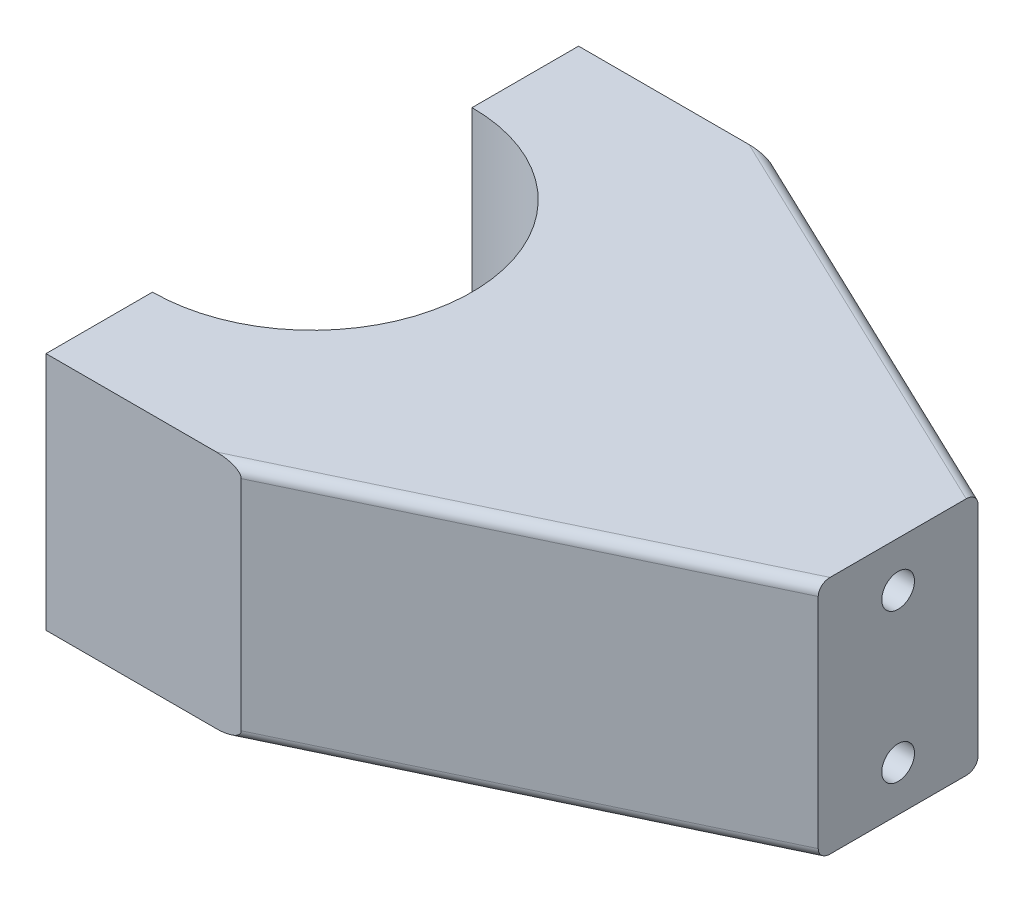
ISO-10303-21;
HEADER;
FILE_DESCRIPTION(('STEP AP214'),'2;1');
FILE_NAME('part.step','',(''),(''),'','','');
FILE_SCHEMA(('AUTOMOTIVE_DESIGN { 1 0 10303 214 1 1 1 1 }'));
ENDSEC;
DATA;
#1=APPLICATION_CONTEXT('core data for automotive mechanical design processes');
#2=APPLICATION_PROTOCOL_DEFINITION('international standard','automotive_design',2000,#1);
#3=PRODUCT_CONTEXT('',#1,'mechanical');
#4=PRODUCT('Part','Part','',(#3));
#5=PRODUCT_RELATED_PRODUCT_CATEGORY('part','',(#4));
#6=PRODUCT_DEFINITION_FORMATION('','',#4);
#7=PRODUCT_DEFINITION_CONTEXT('part definition',#1,'design');
#8=PRODUCT_DEFINITION('design','',#6,#7);
#9=PRODUCT_DEFINITION_SHAPE('','',#8);
#10=(LENGTH_UNIT() NAMED_UNIT(*) SI_UNIT(.MILLI.,.METRE.));
#11=(NAMED_UNIT(*) PLANE_ANGLE_UNIT() SI_UNIT($,.RADIAN.));
#12=(NAMED_UNIT(*) SI_UNIT($,.STERADIAN.) SOLID_ANGLE_UNIT());
#13=UNCERTAINTY_MEASURE_WITH_UNIT(LENGTH_MEASURE(1.E-05),#10,'distance_accuracy_value','');
#14=(GEOMETRIC_REPRESENTATION_CONTEXT(3) GLOBAL_UNCERTAINTY_ASSIGNED_CONTEXT((#13)) GLOBAL_UNIT_ASSIGNED_CONTEXT((#10,
#11,#12)) REPRESENTATION_CONTEXT('',''));
#15=CARTESIAN_POINT('',(0.,0.,0.));
#16=DIRECTION('',(0.,0.,1.));
#17=DIRECTION('',(1.,0.,0.));
#18=AXIS2_PLACEMENT_3D('',#15,#16,#17);
#19=CARTESIAN_POINT('',(0.,45.,0.));
#20=DIRECTION('',(0.,-1.,0.));
#21=DIRECTION('',(0.,0.,-1.));
#22=AXIS2_PLACEMENT_3D('',#19,#20,#21);
#23=CYLINDRICAL_SURFACE('',#22,30.);
#24=CARTESIAN_POINT('',(29.8419901313569,36.5,-3.075));
#25=CARTESIAN_POINT('',(29.8419921978956,36.6722366388709,-3.07499255046563));
#26=CARTESIAN_POINT('',(29.8434973298916,36.8445866006055,-3.06048029868935));
#27=CARTESIAN_POINT('',(29.8493542714437,37.1845064342771,-3.00280821735037));
#28=CARTESIAN_POINT('',(29.8537092034506,37.3520708524054,-2.9596169641989));
#29=CARTESIAN_POINT('',(29.8647673883871,37.6774479210069,-2.84585920691809));
#30=CARTESIAN_POINT('',(29.8714692021085,37.8352664784429,-2.77530947733503));
#31=CARTESIAN_POINT('',(29.8864642587014,38.1367886166801,-2.6088699875744));
#32=CARTESIAN_POINT('',(29.8947571893951,38.2804949579564,-2.51298519675745));
#33=CARTESIAN_POINT('',(29.9120354943515,38.5502949792192,-2.29820475852892));
#34=CARTESIAN_POINT('',(29.9210231220892,38.6763272600604,-2.17923215722567));
#35=CARTESIAN_POINT('',(29.9386577045844,38.9066727017216,-1.92181787300328));
#36=CARTESIAN_POINT('',(29.9473046436208,39.0109848612084,-1.78337529297886));
#37=CARTESIAN_POINT('',(29.9633059136948,39.1951420609444,-1.49057379160697));
#38=CARTESIAN_POINT('',(29.9706573520795,39.2749326363343,-1.33618044311441));
#39=CARTESIAN_POINT('',(29.9832147651476,39.4074332302238,-1.01609891076181));
#40=CARTESIAN_POINT('',(29.9884207945771,39.460143939749,-0.850411015238922));
#41=CARTESIAN_POINT('',(29.9960849888134,39.5368081189108,-0.513064830368699));
#42=CARTESIAN_POINT('',(29.9985527995833,39.5608625586188,-0.341429709770078));
#43=CARTESIAN_POINT('',(30.0004953190584,39.5798438455887,0.00345802840379415));
#44=CARTESIAN_POINT('',(29.9999701089945,39.5747714833559,0.176710601953745));
#45=CARTESIAN_POINT('',(29.9959936508524,39.5357250226259,0.519229667920875));
#46=CARTESIAN_POINT('',(29.9925533951891,39.5018594993133,0.688508683132891));
#47=CARTESIAN_POINT('',(29.9831460584359,39.4063572322864,1.01896753997516));
#48=CARTESIAN_POINT('',(29.9771789431041,39.3447201122329,1.18014727181725));
#49=CARTESIAN_POINT('',(29.9633698094127,39.1953055801985,1.49017395047475));
#50=CARTESIAN_POINT('',(29.9555243570751,39.1074802178032,1.63899762886901));
#51=CARTESIAN_POINT('',(29.9388386434515,38.9082170641667,1.91983374895158));
#52=CARTESIAN_POINT('',(29.9299983515061,38.796778545115,2.051845672263));
#53=CARTESIAN_POINT('',(29.9122668040739,38.5528420056472,2.29594706433967));
#54=CARTESIAN_POINT('',(29.9033755011407,38.4202495188587,2.40794214844828));
#55=CARTESIAN_POINT('',(29.886584556103,38.1380961107381,2.60809975531714));
#56=CARTESIAN_POINT('',(29.878684915559,37.9885351627032,2.69626224057184));
#57=CARTESIAN_POINT('',(29.8647710833547,37.676616743218,2.84625210937122));
#58=CARTESIAN_POINT('',(29.8587573203639,37.5142563728752,2.90807350659896));
#59=CARTESIAN_POINT('',(29.8493049318841,37.1813844706606,3.00355081585883));
#60=CARTESIAN_POINT('',(29.845866223881,37.0108732001602,3.03720763039262));
#61=CARTESIAN_POINT('',(29.841967640751,36.6673687334843,3.07527864708242));
#62=CARTESIAN_POINT('',(29.8414943078287,36.494390326286,3.07982496382173));
#63=CARTESIAN_POINT('',(29.8435445452487,36.1501341650914,3.05989303970163));
#64=CARTESIAN_POINT('',(29.8460680730083,35.9788563869655,3.03541521125118));
#65=CARTESIAN_POINT('',(29.8538154455862,35.6432494998399,2.95824043047214));
#66=CARTESIAN_POINT('',(29.8590332988459,35.4789058444875,2.90560608244524));
#67=CARTESIAN_POINT('',(29.8715765376284,35.1613798930316,2.77367631936681));
#68=CARTESIAN_POINT('',(29.8789019737908,35.0081978652238,2.69438026369671));
#69=CARTESIAN_POINT('',(29.8948675291864,34.7167416630199,2.5110476038794));
#70=CARTESIAN_POINT('',(29.9035122564002,34.5785227624024,2.40692353484861));
#71=CARTESIAN_POINT('',(29.9211273212322,34.3214771675033,2.17701575633994));
#72=CARTESIAN_POINT('',(29.9300976673181,34.2026509779748,2.05123148326575));
#73=CARTESIAN_POINT('',(29.9473939234356,33.9873074815346,1.78100034615505));
#74=CARTESIAN_POINT('',(29.9557172626599,33.8908764172521,1.63648456902051));
#75=CARTESIAN_POINT('',(29.9707441705539,33.723654253556,1.33323260680145));
#76=CARTESIAN_POINT('',(29.9774477623906,33.6528627874149,1.17449662515142));
#77=CARTESIAN_POINT('',(29.9884682672713,33.5390751255623,0.847609925359647));
#78=CARTESIAN_POINT('',(29.9927896333892,33.4960270437273,0.679477424765492));
#79=CARTESIAN_POINT('',(29.9985770764033,33.4387788368252,0.338324271802144));
#80=CARTESIAN_POINT('',(30.0000432378967,33.4245778570431,0.165303764414432));
#81=CARTESIAN_POINT('',(29.99995499962,33.4254393365259,-0.179867338241949));
#82=CARTESIAN_POINT('',(29.998414410683,33.4403679952665,-0.352018286596222));
#83=CARTESIAN_POINT('',(29.9925130419523,33.498784157602,-0.691352871680473));
#84=CARTESIAN_POINT('',(29.9881522602581,33.5422716804416,-0.858536505063074));
#85=CARTESIAN_POINT('',(29.9770990134707,33.6565335867322,-1.18318817571419));
#86=CARTESIAN_POINT('',(29.9704069027133,33.7273038236904,-1.34065768514202));
#87=CARTESIAN_POINT('',(29.9554365220664,33.8941080569439,-1.64150425583525));
#88=CARTESIAN_POINT('',(29.9471582588744,33.9901419465636,-1.78488137660218));
#89=CARTESIAN_POINT('',(29.929897205993,34.2052486953452,-2.05415880269512));
#90=CARTESIAN_POINT('',(29.9209114726896,34.3244212060624,-2.17997931662633));
#91=CARTESIAN_POINT('',(29.9032730204131,34.582224393948,-2.40989538273532));
#92=CARTESIAN_POINT('',(29.8946203817637,34.7208597274719,-2.51398572124369));
#93=CARTESIAN_POINT('',(29.8786031996864,35.0140587453412,-2.69770717940795));
#94=CARTESIAN_POINT('',(29.8712421404216,35.16866377954,-2.77727256464856));
#95=CARTESIAN_POINT('',(29.8586829897859,35.4890176535774,-2.90920647262452));
#96=CARTESIAN_POINT('',(29.8534824678542,35.6547537259562,-2.96160557342948));
#97=CARTESIAN_POINT('',(29.8471403534705,35.9345177555825,-3.024699399542));
#98=CARTESIAN_POINT('',(29.8452181965685,36.0467590955307,-3.04353622650789));
#99=CARTESIAN_POINT('',(29.8426424062492,36.2726504999706,-3.06868895760516));
#100=CARTESIAN_POINT('',(29.8419887671622,36.3863005581639,-3.07500491769873));
#101=CARTESIAN_POINT('',(29.8419901313569,36.5,-3.075));
#102=B_SPLINE_CURVE_WITH_KNOTS('',3,(#24,#25,#26,#27,#28,#29,#30,#31,#32,#33,#34,#35,#36,#37,
#38,#39,#40,#41,#42,#43,#44,#45,#46,#47,#48,#49,#50,#51,#52,#53,#54,#55,#56,#57,#58,#59,#60,#61,
#62,#63,#64,#65,#66,#67,#68,#69,#70,#71,#72,#73,#74,#75,#76,#77,#78,#79,#80,#81,#82,#83,#84,#85,
#86,#87,#88,#89,#90,#91,#92,#93,#94,#95,#96,#97,#98,#99,#100,#101),.UNSPECIFIED.,.T.,.F.,(4,2,2,
2,2,2,2,2,2,2,2,2,2,2,2,2,2,2,2,2,2,2,2,2,2,2,2,2,2,2,2,2,2,2,2,2,2,2,4),(0.,0.516294693122348,
1.03315602602563,1.54970095093026,2.06614463294027,2.58434019087125,3.10255963318231,
3.6219219093,4.14127093164231,4.65878456908833,5.17628416121111,5.69184094212753,
6.20740470968299,6.72391832733356,7.24044786740997,7.75935217245297,8.278257294095,
8.79728028011002,9.31628663399349,9.83293585884939,10.3495777426377,10.8650756504166,
11.3805859452914,11.897939847913,12.4153072140651,12.9346350711292,13.4539554998664,
13.9723018468809,14.4906328355117,15.0065885897223,15.5225446916175,16.0384224081537,
16.5542979464336,17.0724465751879,17.590719379598,18.1103694716765,18.6294333744775,
18.9702591197356,19.3110833416651),.UNSPECIFIED.);
#103=CARTESIAN_POINT('',(29.8419901313569,36.5,-3.075));
#104=VERTEX_POINT('',#103);
#105=EDGE_CURVE('E223',#104,#104,#102,.T.);
#106=ORIENTED_EDGE('',*,*,#105,.T.);
#107=EDGE_LOOP('',(#106));
#108=FACE_BOUND('',#107,.T.);
#109=CARTESIAN_POINT('',(29.8419901313569,8.5,-3.075));
#110=CARTESIAN_POINT('',(29.8419921978956,8.67223663887092,-3.07499255046563));
#111=CARTESIAN_POINT('',(29.8434973298916,8.84458660060548,-3.06048029868935));
#112=CARTESIAN_POINT('',(29.8493542714437,9.18450643427705,-3.00280821735037));
#113=CARTESIAN_POINT('',(29.8537092034506,9.35207085240541,-2.95961696419891));
#114=CARTESIAN_POINT('',(29.8647673883871,9.67744792100687,-2.84585920691809));
#115=CARTESIAN_POINT('',(29.8714692021085,9.83526647844287,-2.77530947733503));
#116=CARTESIAN_POINT('',(29.8864642587014,10.1367886166801,-2.6088699875744));
#117=CARTESIAN_POINT('',(29.8947571893951,10.2804949579564,-2.51298519675746));
#118=CARTESIAN_POINT('',(29.9120354943515,10.5502949792192,-2.29820475852893));
#119=CARTESIAN_POINT('',(29.9210231220892,10.6763272600604,-2.17923215722568));
#120=CARTESIAN_POINT('',(29.9386577045844,10.9066727017216,-1.92181787300328));
#121=CARTESIAN_POINT('',(29.9473046436208,11.0109848612083,-1.78337529297886));
#122=CARTESIAN_POINT('',(29.9633059136948,11.1951420609444,-1.49057379160697));
#123=CARTESIAN_POINT('',(29.9706573520795,11.2749326363343,-1.33618044311441));
#124=CARTESIAN_POINT('',(29.9832147651476,11.4074332302238,-1.01609891076182));
#125=CARTESIAN_POINT('',(29.9884207945771,11.460143939749,-0.850411015238927));
#126=CARTESIAN_POINT('',(29.9960849888134,11.5368081189108,-0.513064830368704));
#127=CARTESIAN_POINT('',(29.9985527995833,11.5608625586188,-0.341429709770084));
#128=CARTESIAN_POINT('',(30.0004953190584,11.5798438455887,0.00345802840378832));
#129=CARTESIAN_POINT('',(29.9999701089945,11.5747714833559,0.176710601953739));
#130=CARTESIAN_POINT('',(29.9959936508524,11.5357250226259,0.519229667920869));
#131=CARTESIAN_POINT('',(29.9925533951891,11.5018594993133,0.688508683132886));
#132=CARTESIAN_POINT('',(29.9831460584359,11.4063572322864,1.01896753997515));
#133=CARTESIAN_POINT('',(29.9771789431041,11.3447201122329,1.18014727181724));
#134=CARTESIAN_POINT('',(29.9633698094127,11.1953055801985,1.49017395047475));
#135=CARTESIAN_POINT('',(29.9555243570751,11.1074802178032,1.63899762886901));
#136=CARTESIAN_POINT('',(29.9388386434515,10.9082170641667,1.91983374895157));
#137=CARTESIAN_POINT('',(29.9299983515061,10.796778545115,2.051845672263));
#138=CARTESIAN_POINT('',(29.9122668040739,10.5528420056472,2.29594706433966));
#139=CARTESIAN_POINT('',(29.9033755011407,10.4202495188587,2.40794214844827));
#140=CARTESIAN_POINT('',(29.886584556103,10.1380961107381,2.60809975531713));
#141=CARTESIAN_POINT('',(29.878684915559,9.98853516270322,2.69626224057184));
#142=CARTESIAN_POINT('',(29.8647710833547,9.67661674321802,2.84625210937122));
#143=CARTESIAN_POINT('',(29.8587573203639,9.51425637287517,2.90807350659896));
#144=CARTESIAN_POINT('',(29.8493049318841,9.18138447066062,3.00355081585883));
#145=CARTESIAN_POINT('',(29.845866223881,9.01087320016026,3.03720763039262));
#146=CARTESIAN_POINT('',(29.841967640751,8.66736873348432,3.07527864708242));
#147=CARTESIAN_POINT('',(29.8414943078287,8.494390326286,3.07982496382173));
#148=CARTESIAN_POINT('',(29.8435445452487,8.15013416509142,3.05989303970163));
#149=CARTESIAN_POINT('',(29.8460680730083,7.97885638696549,3.03541521125118));
#150=CARTESIAN_POINT('',(29.8538154455862,7.64324949983994,2.95824043047214));
#151=CARTESIAN_POINT('',(29.8590332988459,7.47890584448746,2.90560608244524));
#152=CARTESIAN_POINT('',(29.8715765376284,7.16137989303164,2.77367631936681));
#153=CARTESIAN_POINT('',(29.8789019737908,7.00819786522376,2.69438026369671));
#154=CARTESIAN_POINT('',(29.8948675291864,6.71674166301993,2.5110476038794));
#155=CARTESIAN_POINT('',(29.9035122564002,6.57852276240241,2.40692353484861));
#156=CARTESIAN_POINT('',(29.9211273212322,6.3214771675033,2.17701575633994));
#157=CARTESIAN_POINT('',(29.9300976673181,6.20265097797481,2.05123148326576));
#158=CARTESIAN_POINT('',(29.9473939234356,5.9873074815346,1.78100034615506));
#159=CARTESIAN_POINT('',(29.9557172626599,5.89087641725215,1.63648456902052));
#160=CARTESIAN_POINT('',(29.9707441705539,5.72365425355606,1.33323260680146));
#161=CARTESIAN_POINT('',(29.9774477623906,5.65286278741494,1.17449662515143));
#162=CARTESIAN_POINT('',(29.9884682672713,5.53907512556227,0.847609925359653));
#163=CARTESIAN_POINT('',(29.9927896333892,5.49602704372727,0.679477424765498));
#164=CARTESIAN_POINT('',(29.9985770764033,5.43877883682516,0.338324271802151));
#165=CARTESIAN_POINT('',(30.0000432378967,5.42457785704306,0.16530376441444));
#166=CARTESIAN_POINT('',(29.99995499962,5.42543933652591,-0.179867338241941));
#167=CARTESIAN_POINT('',(29.998414410683,5.4403679952665,-0.352018286596215));
#168=CARTESIAN_POINT('',(29.9925130419523,5.49878415760196,-0.691352871680466));
#169=CARTESIAN_POINT('',(29.9881522602581,5.54227168044164,-0.858536505063067));
#170=CARTESIAN_POINT('',(29.9770990134707,5.65653358673224,-1.18318817571418));
#171=CARTESIAN_POINT('',(29.9704069027133,5.72730382369041,-1.34065768514201));
#172=CARTESIAN_POINT('',(29.9554365220664,5.89410805694389,-1.64150425583524));
#173=CARTESIAN_POINT('',(29.9471582588744,5.99014194656355,-1.78488137660218));
#174=CARTESIAN_POINT('',(29.929897205993,6.20524869534524,-2.05415880269512));
#175=CARTESIAN_POINT('',(29.9209114726896,6.32442120606239,-2.17997931662632));
#176=CARTESIAN_POINT('',(29.9032730204131,6.58222439394804,-2.40989538273532));
#177=CARTESIAN_POINT('',(29.8946203817637,6.72085972747187,-2.51398572124369));
#178=CARTESIAN_POINT('',(29.8786031996864,7.01405874534125,-2.69770717940795));
#179=CARTESIAN_POINT('',(29.8712421404216,7.16866377954001,-2.77727256464856));
#180=CARTESIAN_POINT('',(29.8586829897859,7.48901765357743,-2.90920647262452));
#181=CARTESIAN_POINT('',(29.8534824678542,7.65475372595615,-2.96160557342948));
#182=CARTESIAN_POINT('',(29.8471403534705,7.93451775558254,-3.024699399542));
#183=CARTESIAN_POINT('',(29.8452181965685,8.04675909553065,-3.04353622650789));
#184=CARTESIAN_POINT('',(29.8426424062492,8.27265049997064,-3.06868895760516));
#185=CARTESIAN_POINT('',(29.8419887671622,8.38630055816394,-3.07500491769873));
#186=CARTESIAN_POINT('',(29.8419901313569,8.5,-3.075));
#187=B_SPLINE_CURVE_WITH_KNOTS('',3,(#109,#110,#111,#112,#113,#114,#115,#116,#117,#118,#119,
#120,#121,#122,#123,#124,#125,#126,#127,#128,#129,#130,#131,#132,#133,#134,#135,#136,#137,#138,
#139,#140,#141,#142,#143,#144,#145,#146,#147,#148,#149,#150,#151,#152,#153,#154,#155,#156,#157,
#158,#159,#160,#161,#162,#163,#164,#165,#166,#167,#168,#169,#170,#171,#172,#173,#174,#175,#176,
#177,#178,#179,#180,#181,#182,#183,#184,#185,#186),.UNSPECIFIED.,.T.,.F.,(4,2,2,2,2,2,2,2,2,2,2,
2,2,2,2,2,2,2,2,2,2,2,2,2,2,2,2,2,2,2,2,2,2,2,2,2,2,2,4),(0.,0.516294693122347,1.03315602602562,
1.54970095093025,2.06614463294026,2.58434019087124,3.10255963318231,3.62192190929999,
4.14127093164231,4.65878456908832,5.17628416121111,5.69184094212752,6.20740470968299,
6.72391832733356,7.24044786740996,7.75935217245296,8.27825729409499,8.79728028011,
9.31628663399348,9.83293585884938,10.3495777426377,10.8650756504166,11.3805859452914,
11.8979398479131,12.4153072140651,12.9346350711292,13.4539554998664,13.9723018468809,
14.4906328355117,15.0065885897223,15.5225446916175,16.0384224081537,16.5542979464336,
17.0724465751879,17.5907193795979,18.1103694716765,18.6294333744775,18.9702591197356,
19.3110833416651),.UNSPECIFIED.);
#188=CARTESIAN_POINT('',(29.8419901313569,8.5,-3.075));
#189=VERTEX_POINT('',#188);
#190=EDGE_CURVE('E235',#189,#189,#187,.T.);
#191=ORIENTED_EDGE('',*,*,#190,.T.);
#192=EDGE_LOOP('',(#191));
#193=FACE_BOUND('',#192,.T.);
#194=CARTESIAN_POINT('',(0.,0.,0.));
#195=DIRECTION('',(0.,-1.,0.));
#196=DIRECTION('',(0.,0.,1.));
#197=AXIS2_PLACEMENT_3D('',#194,#195,#196);
#198=CIRCLE('',#197,30.);
#199=CARTESIAN_POINT('',(0.,0.,-30.));
#200=VERTEX_POINT('',#199);
#201=CARTESIAN_POINT('',(0.,0.,30.));
#202=VERTEX_POINT('',#201);
#203=EDGE_CURVE('E150',#200,#202,#198,.T.);
#204=ORIENTED_EDGE('',*,*,#203,.T.);
#205=DIRECTION('',(0.,-1.,0.));
#206=VECTOR('',#205,1.);
#207=CARTESIAN_POINT('',(0.,45.,30.));
#208=LINE('',#207,#206);
#209=CARTESIAN_POINT('',(0.,45.,30.));
#210=VERTEX_POINT('',#209);
#211=EDGE_CURVE('E129',#210,#202,#208,.T.);
#212=ORIENTED_EDGE('',*,*,#211,.F.);
#213=CARTESIAN_POINT('',(0.,45.,0.));
#214=DIRECTION('',(0.,-1.,0.));
#215=DIRECTION('',(0.,0.,1.));
#216=AXIS2_PLACEMENT_3D('',#213,#214,#215);
#217=CIRCLE('',#216,30.);
#218=CARTESIAN_POINT('',(0.,45.,-30.));
#219=VERTEX_POINT('',#218);
#220=EDGE_CURVE('E137',#219,#210,#217,.T.);
#221=ORIENTED_EDGE('',*,*,#220,.F.);
#222=DIRECTION('',(0.,-1.,0.));
#223=VECTOR('',#222,1.);
#224=CARTESIAN_POINT('',(0.,45.,-30.));
#225=LINE('',#224,#223);
#226=EDGE_CURVE('E211',#219,#200,#225,.T.);
#227=ORIENTED_EDGE('',*,*,#226,.T.);
#228=EDGE_LOOP('',(#204,#212,#221,#227));
#229=FACE_BOUND('',#228,.T.);
#230=ADVANCED_FACE('F36',(#108,#193,#229),#23,.F.);
#231=CARTESIAN_POINT('',(0.,45.,30.));
#232=DIRECTION('',(1.,0.,0.));
#233=DIRECTION('',(0.,0.,-1.));
#234=AXIS2_PLACEMENT_3D('',#231,#232,#233);
#235=PLANE('',#234);
#236=DIRECTION('',(0.,0.,1.));
#237=VECTOR('',#236,1.);
#238=CARTESIAN_POINT('',(0.,0.,30.));
#239=LINE('',#238,#237);
#240=CARTESIAN_POINT('',(0.,0.,50.));
#241=VERTEX_POINT('',#240);
#242=EDGE_CURVE('E220',#202,#241,#239,.T.);
#243=ORIENTED_EDGE('',*,*,#242,.T.);
#244=DIRECTION('',(0.,-1.,0.));
#245=VECTOR('',#244,1.);
#246=CARTESIAN_POINT('',(0.,45.,50.));
#247=LINE('',#246,#245);
#248=CARTESIAN_POINT('',(0.,45.,50.));
#249=VERTEX_POINT('',#248);
#250=EDGE_CURVE('E132',#249,#241,#247,.T.);
#251=ORIENTED_EDGE('',*,*,#250,.F.);
#252=DIRECTION('',(0.,0.,1.));
#253=VECTOR('',#252,1.);
#254=CARTESIAN_POINT('',(0.,45.,30.));
#255=LINE('',#254,#253);
#256=EDGE_CURVE('E125',#210,#249,#255,.T.);
#257=ORIENTED_EDGE('',*,*,#256,.F.);
#258=ORIENTED_EDGE('',*,*,#211,.T.);
#259=EDGE_LOOP('',(#243,#251,#257,#258));
#260=FACE_BOUND('',#259,.T.);
#261=ADVANCED_FACE('F127',(#260),#235,.F.);
#262=CARTESIAN_POINT('',(0.,45.,50.));
#263=DIRECTION('',(0.,0.,-1.));
#264=DIRECTION('',(-1.,0.,0.));
#265=AXIS2_PLACEMENT_3D('',#262,#263,#264);
#266=PLANE('',#265);
#267=DIRECTION('',(1.,0.,0.));
#268=VECTOR('',#267,1.);
#269=CARTESIAN_POINT('',(0.,0.,50.));
#270=LINE('',#269,#268);
#271=CARTESIAN_POINT('',(32.0170085102515,0.,50.));
#272=VERTEX_POINT('',#271);
#273=EDGE_CURVE('E218',#241,#272,#270,.T.);
#274=ORIENTED_EDGE('',*,*,#273,.T.);
#275=CARTESIAN_POINT('',(32.0170085102515,2.,50.));
#276=DIRECTION('',(0.,0.,-1.));
#277=DIRECTION('',(1.,0.,0.));
#278=AXIS2_PLACEMENT_3D('',#275,#276,#277);
#279=ELLIPSE('',#278,4.64359704939519,2.);
#280=CARTESIAN_POINT('',(36.6606055596467,2.00000000000002,50.));
#281=VERTEX_POINT('',#280);
#282=EDGE_CURVE('E11',#272,#281,#279,.F.);
#283=ORIENTED_EDGE('',*,*,#282,.T.);
#284=DIRECTION('',(0.,-1.,0.));
#285=VECTOR('',#284,1.);
#286=CARTESIAN_POINT('',(36.6606055596467,45.,50.));
#287=LINE('',#286,#285);
#288=CARTESIAN_POINT('',(36.6606055596467,43.,50.));
#289=VERTEX_POINT('',#288);
#290=EDGE_CURVE('E155',#289,#281,#287,.T.);
#291=ORIENTED_EDGE('',*,*,#290,.F.);
#292=CARTESIAN_POINT('',(32.0170085102515,43.,50.));
#293=DIRECTION('',(0.,0.,-1.));
#294=DIRECTION('',(-1.,0.,0.));
#295=AXIS2_PLACEMENT_3D('',#292,#293,#294);
#296=ELLIPSE('',#295,4.64359704939519,2.);
#297=CARTESIAN_POINT('',(32.0170085102515,45.,50.));
#298=VERTEX_POINT('',#297);
#299=EDGE_CURVE('E44',#289,#298,#296,.F.);
#300=ORIENTED_EDGE('',*,*,#299,.T.);
#301=DIRECTION('',(1.,0.,0.));
#302=VECTOR('',#301,1.);
#303=CARTESIAN_POINT('',(0.,45.,50.));
#304=LINE('',#303,#302);
#305=EDGE_CURVE('E136',#249,#298,#304,.T.);
#306=ORIENTED_EDGE('',*,*,#305,.F.);
#307=ORIENTED_EDGE('',*,*,#250,.T.);
#308=EDGE_LOOP('',(#274,#283,#291,#300,#306,#307));
#309=FACE_BOUND('',#308,.T.);
#310=ADVANCED_FACE('F187',(#309),#266,.F.);
#311=CARTESIAN_POINT('',(36.6606055596467,45.,50.));
#312=DIRECTION('',(-0.430700592391084,0.,-0.902494875173244));
#313=DIRECTION('',(-0.902494875173244,0.,0.430700592391084));
#314=AXIS2_PLACEMENT_3D('',#311,#312,#313);
#315=PLANE('',#314);
#316=ORIENTED_EDGE('',*,*,#290,.T.);
#317=DIRECTION('',(0.902494875173244,0.,-0.430700592391084));
#318=VECTOR('',#317,1.);
#319=CARTESIAN_POINT('',(36.6606055596467,2.,50.));
#320=LINE('',#319,#318);
#321=CARTESIAN_POINT('',(110.,2.00000000000002,15.));
#322=VERTEX_POINT('',#321);
#323=EDGE_CURVE('E184',#281,#322,#320,.T.);
#324=ORIENTED_EDGE('',*,*,#323,.T.);
#325=DIRECTION('',(0.,-1.,0.));
#326=VECTOR('',#325,1.);
#327=CARTESIAN_POINT('',(110.,45.,15.));
#328=LINE('',#327,#326);
#329=CARTESIAN_POINT('',(110.,43.,15.));
#330=VERTEX_POINT('',#329);
#331=EDGE_CURVE('E197',#330,#322,#328,.T.);
#332=ORIENTED_EDGE('',*,*,#331,.F.);
#333=DIRECTION('',(0.902494875173244,0.,-0.430700592391084));
#334=VECTOR('',#333,1.);
#335=CARTESIAN_POINT('',(36.6606055596467,43.,50.));
#336=LINE('',#335,#334);
#337=EDGE_CURVE('E56',#330,#289,#336,.F.);
#338=ORIENTED_EDGE('',*,*,#337,.T.);
#339=EDGE_LOOP('',(#316,#324,#332,#338));
#340=FACE_BOUND('',#339,.T.);
#341=ADVANCED_FACE('F198',(#340),#315,.F.);
#342=CARTESIAN_POINT('',(110.,45.,-15.));
#343=DIRECTION('',(-1.,0.,0.));
#344=DIRECTION('',(0.,0.,1.));
#345=AXIS2_PLACEMENT_3D('',#342,#343,#344);
#346=PLANE('',#345);
#347=CARTESIAN_POINT('',(110.,36.5,0.));
#348=DIRECTION('',(1.,0.,0.));
#349=DIRECTION('',(0.,0.,-1.));
#350=AXIS2_PLACEMENT_3D('',#347,#348,#349);
#351=CIRCLE('',#350,3.075);
#352=CARTESIAN_POINT('',(110.,36.5,-3.075));
#353=VERTEX_POINT('',#352);
#354=EDGE_CURVE('E290',#353,#353,#351,.T.);
#355=ORIENTED_EDGE('',*,*,#354,.F.);
#356=EDGE_LOOP('',(#355));
#357=FACE_BOUND('',#356,.T.);
#358=CARTESIAN_POINT('',(110.,8.5,0.));
#359=DIRECTION('',(1.,0.,0.));
#360=DIRECTION('',(0.,0.,1.));
#361=AXIS2_PLACEMENT_3D('',#358,#359,#360);
#362=CIRCLE('',#361,3.075);
#363=CARTESIAN_POINT('',(110.,8.5,3.075));
#364=VERTEX_POINT('',#363);
#365=EDGE_CURVE('E292',#364,#364,#362,.T.);
#366=ORIENTED_EDGE('',*,*,#365,.F.);
#367=EDGE_LOOP('',(#366));
#368=FACE_BOUND('',#367,.T.);
#369=DIRECTION('',(0.,0.,-1.));
#370=VECTOR('',#369,1.);
#371=CARTESIAN_POINT('',(110.,0.,-15.));
#372=LINE('',#371,#370);
#373=CARTESIAN_POINT('',(110.,0.,12.7839209340484));
#374=VERTEX_POINT('',#373);
#375=CARTESIAN_POINT('',(110.,0.,-12.7839209340484));
#376=VERTEX_POINT('',#375);
#377=EDGE_CURVE('E216',#374,#376,#372,.T.);
#378=ORIENTED_EDGE('',*,*,#377,.T.);
#379=CARTESIAN_POINT('',(110.,2.,-12.7839209340484));
#380=DIRECTION('',(-1.,0.,0.));
#381=DIRECTION('',(0.,0.,-1.));
#382=AXIS2_PLACEMENT_3D('',#379,#380,#381);
#383=ELLIPSE('',#382,2.21607906595157,2.);
#384=CARTESIAN_POINT('',(110.,2.00000000000002,-15.));
#385=VERTEX_POINT('',#384);
#386=EDGE_CURVE('E175',#376,#385,#383,.F.);
#387=ORIENTED_EDGE('',*,*,#386,.T.);
#388=DIRECTION('',(0.,-1.,0.));
#389=VECTOR('',#388,1.);
#390=CARTESIAN_POINT('',(110.,45.,-15.));
#391=LINE('',#390,#389);
#392=CARTESIAN_POINT('',(110.,43.,-15.));
#393=VERTEX_POINT('',#392);
#394=EDGE_CURVE('E200',#393,#385,#391,.T.);
#395=ORIENTED_EDGE('',*,*,#394,.F.);
#396=CARTESIAN_POINT('',(110.,43.,-12.7839209340484));
#397=DIRECTION('',(-1.,0.,0.));
#398=DIRECTION('',(0.,0.,1.));
#399=AXIS2_PLACEMENT_3D('',#396,#397,#398);
#400=ELLIPSE('',#399,2.21607906595157,2.);
#401=CARTESIAN_POINT('',(110.,45.,-12.7839209340484));
#402=VERTEX_POINT('',#401);
#403=EDGE_CURVE('E173',#393,#402,#400,.F.);
#404=ORIENTED_EDGE('',*,*,#403,.T.);
#405=DIRECTION('',(0.,0.,-1.));
#406=VECTOR('',#405,1.);
#407=CARTESIAN_POINT('',(110.,45.,-15.));
#408=LINE('',#407,#406);
#409=CARTESIAN_POINT('',(110.,45.,12.7839209340484));
#410=VERTEX_POINT('',#409);
#411=EDGE_CURVE('E191',#410,#402,#408,.T.);
#412=ORIENTED_EDGE('',*,*,#411,.F.);
#413=CARTESIAN_POINT('',(110.,43.,12.7839209340484));
#414=DIRECTION('',(-1.,0.,0.));
#415=DIRECTION('',(0.,0.,1.));
#416=AXIS2_PLACEMENT_3D('',#413,#414,#415);
#417=ELLIPSE('',#416,2.21607906595157,2.);
#418=EDGE_CURVE('E169',#410,#330,#417,.F.);
#419=ORIENTED_EDGE('',*,*,#418,.T.);
#420=ORIENTED_EDGE('',*,*,#331,.T.);
#421=CARTESIAN_POINT('',(110.,2.,12.7839209340484));
#422=DIRECTION('',(-1.,0.,0.));
#423=DIRECTION('',(0.,0.,-1.));
#424=AXIS2_PLACEMENT_3D('',#421,#422,#423);
#425=ELLIPSE('',#424,2.21607906595157,2.);
#426=EDGE_CURVE('E171',#322,#374,#425,.F.);
#427=ORIENTED_EDGE('',*,*,#426,.T.);
#428=EDGE_LOOP('',(#378,#387,#395,#404,#412,#419,#420,#427));
#429=FACE_BOUND('',#428,.T.);
#430=ADVANCED_FACE('F196',(#357,#368,#429),#346,.F.);
#431=CARTESIAN_POINT('',(36.6606055596467,45.,-50.));
#432=DIRECTION('',(-0.430700592391084,0.,0.902494875173244));
#433=DIRECTION('',(0.902494875173244,0.,0.430700592391084));
#434=AXIS2_PLACEMENT_3D('',#431,#432,#433);
#435=PLANE('',#434);
#436=ORIENTED_EDGE('',*,*,#394,.T.);
#437=DIRECTION('',(-0.902494875173244,0.,-0.430700592391084));
#438=VECTOR('',#437,1.);
#439=CARTESIAN_POINT('',(36.6606055596467,2.,-50.));
#440=LINE('',#439,#438);
#441=CARTESIAN_POINT('',(36.6606055596467,2.00000000000002,-50.));
#442=VERTEX_POINT('',#441);
#443=EDGE_CURVE('E153',#385,#442,#440,.T.);
#444=ORIENTED_EDGE('',*,*,#443,.T.);
#445=DIRECTION('',(0.,-1.,0.));
#446=VECTOR('',#445,1.);
#447=CARTESIAN_POINT('',(36.6606055596467,45.,-50.));
#448=LINE('',#447,#446);
#449=CARTESIAN_POINT('',(36.6606055596467,43.,-50.));
#450=VERTEX_POINT('',#449);
#451=EDGE_CURVE('E203',#450,#442,#448,.T.);
#452=ORIENTED_EDGE('',*,*,#451,.F.);
#453=DIRECTION('',(-0.902494875173244,0.,-0.430700592391084));
#454=VECTOR('',#453,1.);
#455=CARTESIAN_POINT('',(110.,43.,-15.));
#456=LINE('',#455,#454);
#457=EDGE_CURVE('E151',#450,#393,#456,.F.);
#458=ORIENTED_EDGE('',*,*,#457,.T.);
#459=EDGE_LOOP('',(#436,#444,#452,#458));
#460=FACE_BOUND('',#459,.T.);
#461=ADVANCED_FACE('F267',(#460),#435,.F.);
#462=CARTESIAN_POINT('',(0.,45.,-50.));
#463=DIRECTION('',(0.,0.,1.));
#464=DIRECTION('',(1.,0.,0.));
#465=AXIS2_PLACEMENT_3D('',#462,#463,#464);
#466=PLANE('',#465);
#467=ORIENTED_EDGE('',*,*,#451,.T.);
#468=CARTESIAN_POINT('',(32.0170085102515,2.,-50.));
#469=DIRECTION('',(0.,0.,1.));
#470=DIRECTION('',(-1.,0.,0.));
#471=AXIS2_PLACEMENT_3D('',#468,#469,#470);
#472=ELLIPSE('',#471,4.64359704939519,2.);
#473=CARTESIAN_POINT('',(32.0170085102515,0.,-50.));
#474=VERTEX_POINT('',#473);
#475=EDGE_CURVE('E163',#442,#474,#472,.F.);
#476=ORIENTED_EDGE('',*,*,#475,.T.);
#477=DIRECTION('',(-1.,0.,0.));
#478=VECTOR('',#477,1.);
#479=CARTESIAN_POINT('',(0.,0.,-50.));
#480=LINE('',#479,#478);
#481=CARTESIAN_POINT('',(0.,0.,-50.));
#482=VERTEX_POINT('',#481);
#483=EDGE_CURVE('E214',#474,#482,#480,.T.);
#484=ORIENTED_EDGE('',*,*,#483,.T.);
#485=DIRECTION('',(0.,-1.,0.));
#486=VECTOR('',#485,1.);
#487=CARTESIAN_POINT('',(0.,45.,-50.));
#488=LINE('',#487,#486);
#489=CARTESIAN_POINT('',(0.,45.,-50.));
#490=VERTEX_POINT('',#489);
#491=EDGE_CURVE('E208',#490,#482,#488,.T.);
#492=ORIENTED_EDGE('',*,*,#491,.F.);
#493=DIRECTION('',(-1.,0.,0.));
#494=VECTOR('',#493,1.);
#495=CARTESIAN_POINT('',(0.,45.,-50.));
#496=LINE('',#495,#494);
#497=CARTESIAN_POINT('',(32.0170085102515,45.,-50.));
#498=VERTEX_POINT('',#497);
#499=EDGE_CURVE('E225',#498,#490,#496,.T.);
#500=ORIENTED_EDGE('',*,*,#499,.F.);
#501=CARTESIAN_POINT('',(32.0170085102515,43.,-50.));
#502=DIRECTION('',(0.,0.,1.));
#503=DIRECTION('',(1.,0.,0.));
#504=AXIS2_PLACEMENT_3D('',#501,#502,#503);
#505=ELLIPSE('',#504,4.64359704939519,2.);
#506=EDGE_CURVE('E161',#498,#450,#505,.F.);
#507=ORIENTED_EDGE('',*,*,#506,.T.);
#508=EDGE_LOOP('',(#467,#476,#484,#492,#500,#507));
#509=FACE_BOUND('',#508,.T.);
#510=ADVANCED_FACE('F263',(#509),#466,.F.);
#511=CARTESIAN_POINT('',(0.,45.,-30.));
#512=DIRECTION('',(1.,0.,0.));
#513=DIRECTION('',(0.,0.,-1.));
#514=AXIS2_PLACEMENT_3D('',#511,#512,#513);
#515=PLANE('',#514);
#516=DIRECTION('',(0.,0.,1.));
#517=VECTOR('',#516,1.);
#518=CARTESIAN_POINT('',(0.,0.,-30.));
#519=LINE('',#518,#517);
#520=EDGE_CURVE('E147',#482,#200,#519,.T.);
#521=ORIENTED_EDGE('',*,*,#520,.T.);
#522=ORIENTED_EDGE('',*,*,#226,.F.);
#523=DIRECTION('',(0.,0.,1.));
#524=VECTOR('',#523,1.);
#525=CARTESIAN_POINT('',(0.,45.,-30.));
#526=LINE('',#525,#524);
#527=EDGE_CURVE('E143',#490,#219,#526,.T.);
#528=ORIENTED_EDGE('',*,*,#527,.F.);
#529=ORIENTED_EDGE('',*,*,#491,.T.);
#530=EDGE_LOOP('',(#521,#522,#528,#529));
#531=FACE_BOUND('',#530,.T.);
#532=ADVANCED_FACE('F257',(#531),#515,.F.);
#533=CARTESIAN_POINT('',(0.,45.,0.));
#534=DIRECTION('',(0.,1.,0.));
#535=DIRECTION('',(0.,0.,1.));
#536=AXIS2_PLACEMENT_3D('',#533,#534,#535);
#537=PLANE('',#536);
#538=ORIENTED_EDGE('',*,*,#411,.T.);
#539=DIRECTION('',(-0.902494875173244,0.,-0.430700592391084));
#540=VECTOR('',#539,1.);
#541=CARTESIAN_POINT('',(35.7992043748645,45.,-48.1950102496535));
#542=LINE('',#541,#540);
#543=EDGE_CURVE('E180',#402,#498,#542,.T.);
#544=ORIENTED_EDGE('',*,*,#543,.T.);
#545=ORIENTED_EDGE('',*,*,#499,.T.);
#546=ORIENTED_EDGE('',*,*,#527,.T.);
#547=ORIENTED_EDGE('',*,*,#220,.T.);
#548=ORIENTED_EDGE('',*,*,#256,.T.);
#549=ORIENTED_EDGE('',*,*,#305,.T.);
#550=DIRECTION('',(0.902494875173244,0.,-0.430700592391084));
#551=VECTOR('',#550,1.);
#552=CARTESIAN_POINT('',(109.138598815218,45.,13.1950102496535));
#553=LINE('',#552,#551);
#554=EDGE_CURVE('E177',#298,#410,#553,.T.);
#555=ORIENTED_EDGE('',*,*,#554,.T.);
#556=EDGE_LOOP('',(#538,#544,#545,#546,#547,#548,#549,#555));
#557=FACE_BOUND('',#556,.T.);
#558=ADVANCED_FACE('F141',(#557),#537,.T.);
#559=CARTESIAN_POINT('',(0.,0.,0.));
#560=DIRECTION('',(0.,1.,0.));
#561=DIRECTION('',(0.,0.,1.));
#562=AXIS2_PLACEMENT_3D('',#559,#560,#561);
#563=PLANE('',#562);
#564=ORIENTED_EDGE('',*,*,#483,.F.);
#565=DIRECTION('',(-0.902494875173244,0.,-0.430700592391084));
#566=VECTOR('',#565,1.);
#567=CARTESIAN_POINT('',(25.3745050071867,0.,-53.1700237557368));
#568=LINE('',#567,#566);
#569=EDGE_CURVE('E167',#474,#376,#568,.F.);
#570=ORIENTED_EDGE('',*,*,#569,.T.);
#571=ORIENTED_EDGE('',*,*,#377,.F.);
#572=DIRECTION('',(0.902494875173244,0.,-0.430700592391084));
#573=VECTOR('',#572,1.);
#574=CARTESIAN_POINT('',(25.3745050071867,0.,53.1700237557368));
#575=LINE('',#574,#573);
#576=EDGE_CURVE('E165',#374,#272,#575,.F.);
#577=ORIENTED_EDGE('',*,*,#576,.T.);
#578=ORIENTED_EDGE('',*,*,#273,.F.);
#579=ORIENTED_EDGE('',*,*,#242,.F.);
#580=ORIENTED_EDGE('',*,*,#203,.F.);
#581=ORIENTED_EDGE('',*,*,#520,.F.);
#582=EDGE_LOOP('',(#564,#570,#571,#577,#578,#579,#580,#581));
#583=FACE_BOUND('',#582,.T.);
#584=ADVANCED_FACE('F253',(#583),#563,.F.);
#585=CARTESIAN_POINT('',(0.,8.5,0.));
#586=DIRECTION('',(1.,0.,0.));
#587=DIRECTION('',(0.,0.,-1.));
#588=AXIS2_PLACEMENT_3D('',#585,#586,#587);
#589=CYLINDRICAL_SURFACE('',#588,3.075);
#590=ORIENTED_EDGE('',*,*,#365,.T.);
#591=EDGE_LOOP('',(#590));
#592=FACE_BOUND('',#591,.T.);
#593=ORIENTED_EDGE('',*,*,#190,.F.);
#594=EDGE_LOOP('',(#593));
#595=FACE_BOUND('',#594,.T.);
#596=ADVANCED_FACE('F248',(#592,#595),#589,.F.);
#597=CARTESIAN_POINT('',(0.,36.5,0.));
#598=DIRECTION('',(1.,0.,0.));
#599=DIRECTION('',(0.,0.,-1.));
#600=AXIS2_PLACEMENT_3D('',#597,#598,#599);
#601=CYLINDRICAL_SURFACE('',#600,3.075);
#602=ORIENTED_EDGE('',*,*,#354,.T.);
#603=EDGE_LOOP('',(#602));
#604=FACE_BOUND('',#603,.T.);
#605=ORIENTED_EDGE('',*,*,#105,.F.);
#606=EDGE_LOOP('',(#605));
#607=FACE_BOUND('',#606,.T.);
#608=ADVANCED_FACE('F244',(#604,#607),#601,.F.);
#609=CARTESIAN_POINT('',(35.7992043748645,2.,-48.1950102496535));
#610=DIRECTION('',(-0.902494875173244,0.,-0.430700592391084));
#611=DIRECTION('',(-0.430700592391084,0.,0.902494875173244));
#612=AXIS2_PLACEMENT_3D('',#609,#610,#611);
#613=CYLINDRICAL_SURFACE('',#612,2.);
#614=ORIENTED_EDGE('',*,*,#386,.F.);
#615=ORIENTED_EDGE('',*,*,#569,.F.);
#616=ORIENTED_EDGE('',*,*,#475,.F.);
#617=ORIENTED_EDGE('',*,*,#443,.F.);
#618=EDGE_LOOP('',(#614,#615,#616,#617));
#619=FACE_BOUND('',#618,.T.);
#620=ADVANCED_FACE('F247',(#619),#613,.T.);
#621=CARTESIAN_POINT('',(25.3745050071867,43.,-53.1700237557368));
#622=DIRECTION('',(0.902494875173244,0.,0.430700592391084));
#623=DIRECTION('',(0.430700592391084,0.,-0.902494875173244));
#624=AXIS2_PLACEMENT_3D('',#621,#622,#623);
#625=CYLINDRICAL_SURFACE('',#624,2.);
#626=ORIENTED_EDGE('',*,*,#403,.F.);
#627=ORIENTED_EDGE('',*,*,#457,.F.);
#628=ORIENTED_EDGE('',*,*,#506,.F.);
#629=ORIENTED_EDGE('',*,*,#543,.F.);
#630=EDGE_LOOP('',(#626,#627,#628,#629));
#631=FACE_BOUND('',#630,.T.);
#632=ADVANCED_FACE('F366',(#631),#625,.T.);
#633=CARTESIAN_POINT('',(35.7992043748645,2.,48.1950102496535));
#634=DIRECTION('',(0.902494875173244,0.,-0.430700592391084));
#635=DIRECTION('',(-0.430700592391084,0.,-0.902494875173244));
#636=AXIS2_PLACEMENT_3D('',#633,#634,#635);
#637=CYLINDRICAL_SURFACE('',#636,2.);
#638=ORIENTED_EDGE('',*,*,#282,.F.);
#639=ORIENTED_EDGE('',*,*,#576,.F.);
#640=ORIENTED_EDGE('',*,*,#426,.F.);
#641=ORIENTED_EDGE('',*,*,#323,.F.);
#642=EDGE_LOOP('',(#638,#639,#640,#641));
#643=FACE_BOUND('',#642,.T.);
#644=ADVANCED_FACE('F375',(#643),#637,.T.);
#645=CARTESIAN_POINT('',(25.3745050071867,43.,53.1700237557368));
#646=DIRECTION('',(-0.902494875173244,0.,0.430700592391084));
#647=DIRECTION('',(0.430700592391084,0.,0.902494875173244));
#648=AXIS2_PLACEMENT_3D('',#645,#646,#647);
#649=CYLINDRICAL_SURFACE('',#648,2.);
#650=ORIENTED_EDGE('',*,*,#299,.F.);
#651=ORIENTED_EDGE('',*,*,#337,.F.);
#652=ORIENTED_EDGE('',*,*,#418,.F.);
#653=ORIENTED_EDGE('',*,*,#554,.F.);
#654=EDGE_LOOP('',(#650,#651,#652,#653));
#655=FACE_BOUND('',#654,.T.);
#656=ADVANCED_FACE('F38',(#655),#649,.T.);
#657=CLOSED_SHELL('',(#230,#261,#310,#341,#430,#461,#510,#532,#558,#584,#596,#608,#620,#632,
#644,#656));
#658=MANIFOLD_SOLID_BREP('B2',#657);
#659=ADVANCED_BREP_SHAPE_REPRESENTATION('',(#18,#658),#14);
#660=SHAPE_DEFINITION_REPRESENTATION(#9,#659);
ENDSEC;
END-ISO-10303-21;
